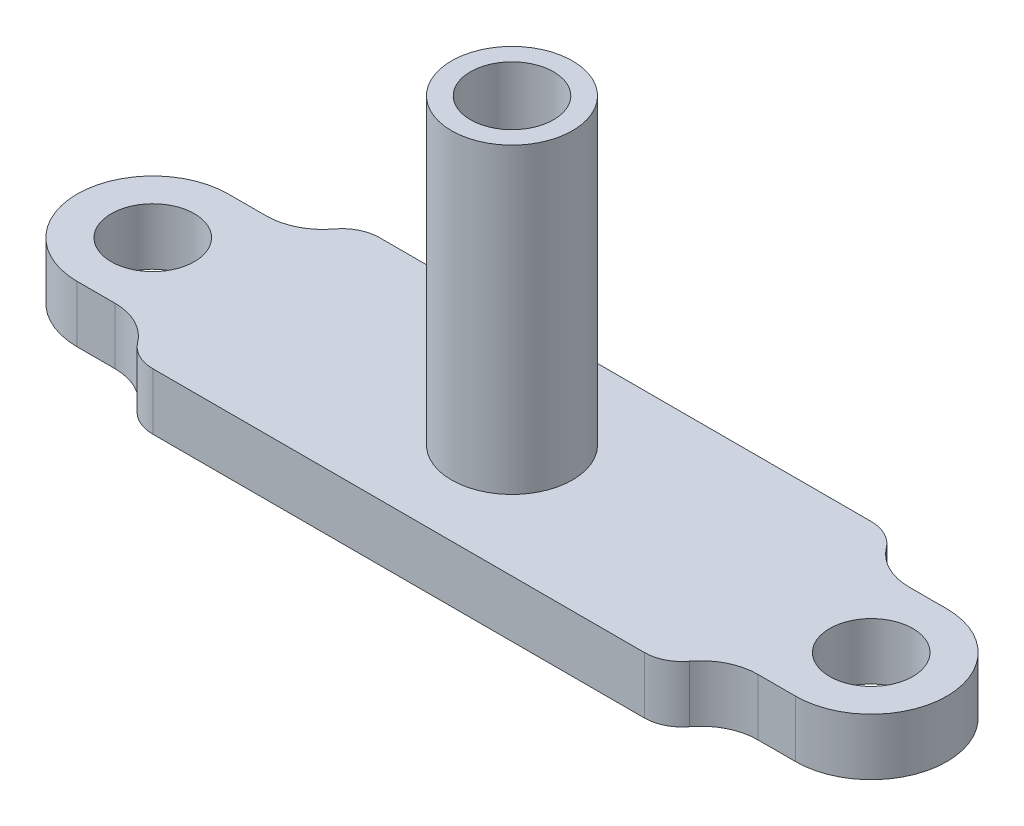
ISO-10303-21;
HEADER;
FILE_DESCRIPTION(('STEP AP214'),'2;1');
FILE_NAME('part.step','',(''),(''),'','','');
FILE_SCHEMA(('AUTOMOTIVE_DESIGN { 1 0 10303 214 1 1 1 1 }'));
ENDSEC;
DATA;
#1=APPLICATION_CONTEXT('core data for automotive mechanical design processes');
#2=APPLICATION_PROTOCOL_DEFINITION('international standard','automotive_design',2000,#1);
#3=PRODUCT_CONTEXT('',#1,'mechanical');
#4=PRODUCT('Part','Part','',(#3));
#5=PRODUCT_RELATED_PRODUCT_CATEGORY('part','',(#4));
#6=PRODUCT_DEFINITION_FORMATION('','',#4);
#7=PRODUCT_DEFINITION_CONTEXT('part definition',#1,'design');
#8=PRODUCT_DEFINITION('design','',#6,#7);
#9=PRODUCT_DEFINITION_SHAPE('','',#8);
#10=(LENGTH_UNIT() NAMED_UNIT(*) SI_UNIT(.MILLI.,.METRE.));
#11=(NAMED_UNIT(*) PLANE_ANGLE_UNIT() SI_UNIT($,.RADIAN.));
#12=(NAMED_UNIT(*) SI_UNIT($,.STERADIAN.) SOLID_ANGLE_UNIT());
#13=UNCERTAINTY_MEASURE_WITH_UNIT(LENGTH_MEASURE(1.E-05),#10,'distance_accuracy_value','');
#14=(GEOMETRIC_REPRESENTATION_CONTEXT(3) GLOBAL_UNCERTAINTY_ASSIGNED_CONTEXT((#13)) GLOBAL_UNIT_ASSIGNED_CONTEXT((#10,
#11,#12)) REPRESENTATION_CONTEXT('',''));
#15=CARTESIAN_POINT('',(0.,0.,0.));
#16=DIRECTION('',(0.,0.,1.));
#17=DIRECTION('',(1.,0.,0.));
#18=AXIS2_PLACEMENT_3D('',#15,#16,#17);
#19=CARTESIAN_POINT('',(-9.5,1.5,0.));
#20=DIRECTION('',(0.,1.,0.));
#21=DIRECTION('',(0.,0.,1.));
#22=AXIS2_PLACEMENT_3D('',#19,#20,#21);
#23=PLANE('',#22);
#24=CARTESIAN_POINT('',(0.,1.5,0.));
#25=DIRECTION('',(0.,1.,0.));
#26=DIRECTION('',(0.,0.,1.));
#27=AXIS2_PLACEMENT_3D('',#24,#25,#26);
#28=CIRCLE('',#27,1.6);
#29=CARTESIAN_POINT('',(0.,1.5,1.6));
#30=VERTEX_POINT('',#29);
#31=EDGE_CURVE('E364',#30,#30,#28,.T.);
#32=ORIENTED_EDGE('',*,*,#31,.F.);
#33=EDGE_LOOP('',(#32));
#34=FACE_BOUND('',#33,.T.);
#35=CARTESIAN_POINT('',(-9.5,1.5,0.));
#36=DIRECTION('',(0.,1.,0.));
#37=DIRECTION('',(0.,0.,1.));
#38=AXIS2_PLACEMENT_3D('',#35,#36,#37);
#39=CIRCLE('',#38,1.1);
#40=CARTESIAN_POINT('',(-9.5,1.5,1.1));
#41=VERTEX_POINT('',#40);
#42=EDGE_CURVE('E206',#41,#41,#39,.T.);
#43=ORIENTED_EDGE('',*,*,#42,.F.);
#44=EDGE_LOOP('',(#43));
#45=FACE_BOUND('',#44,.T.);
#46=DIRECTION('',(1.,0.,0.));
#47=VECTOR('',#46,1.);
#48=CARTESIAN_POINT('',(-7.5,1.5,3.));
#49=LINE('',#48,#47);
#50=CARTESIAN_POINT('',(-6.5,1.5,3.));
#51=VERTEX_POINT('',#50);
#52=CARTESIAN_POINT('',(6.5,1.5,3.));
#53=VERTEX_POINT('',#52);
#54=EDGE_CURVE('E188',#51,#53,#49,.T.);
#55=ORIENTED_EDGE('',*,*,#54,.T.);
#56=CARTESIAN_POINT('',(6.5,1.5,2.));
#57=DIRECTION('',(0.,1.,0.));
#58=DIRECTION('',(0.,0.,1.));
#59=AXIS2_PLACEMENT_3D('',#56,#57,#58);
#60=CIRCLE('',#59,1.);
#61=CARTESIAN_POINT('',(7.3,1.5,2.6));
#62=VERTEX_POINT('',#61);
#63=EDGE_CURVE('E247',#53,#62,#60,.T.);
#64=ORIENTED_EDGE('',*,*,#63,.T.);
#65=CARTESIAN_POINT('',(8.5,1.5,3.5));
#66=DIRECTION('',(0.,1.,0.));
#67=DIRECTION('',(0.,0.,1.));
#68=AXIS2_PLACEMENT_3D('',#65,#66,#67);
#69=CIRCLE('',#68,1.5);
#70=CARTESIAN_POINT('',(8.5,1.5,2.));
#71=VERTEX_POINT('',#70);
#72=EDGE_CURVE('E275',#62,#71,#69,.F.);
#73=ORIENTED_EDGE('',*,*,#72,.T.);
#74=DIRECTION('',(1.,0.,0.));
#75=VECTOR('',#74,1.);
#76=CARTESIAN_POINT('',(9.5,1.5,2.));
#77=LINE('',#76,#75);
#78=CARTESIAN_POINT('',(9.5,1.5,2.));
#79=VERTEX_POINT('',#78);
#80=EDGE_CURVE('E193',#71,#79,#77,.T.);
#81=ORIENTED_EDGE('',*,*,#80,.T.);
#82=CARTESIAN_POINT('',(9.5,1.5,0.));
#83=DIRECTION('',(0.,1.,0.));
#84=DIRECTION('',(0.,0.,-1.));
#85=AXIS2_PLACEMENT_3D('',#82,#83,#84);
#86=CIRCLE('',#85,2.);
#87=CARTESIAN_POINT('',(9.5,1.5,-2.));
#88=VERTEX_POINT('',#87);
#89=EDGE_CURVE('E195',#79,#88,#86,.T.);
#90=ORIENTED_EDGE('',*,*,#89,.T.);
#91=DIRECTION('',(-1.,0.,0.));
#92=VECTOR('',#91,1.);
#93=CARTESIAN_POINT('',(9.5,1.5,-2.));
#94=LINE('',#93,#92);
#95=CARTESIAN_POINT('',(8.5,1.5,-2.));
#96=VERTEX_POINT('',#95);
#97=EDGE_CURVE('E197',#88,#96,#94,.T.);
#98=ORIENTED_EDGE('',*,*,#97,.T.);
#99=CARTESIAN_POINT('',(8.5,1.5,-3.5));
#100=DIRECTION('',(0.,1.,0.));
#101=DIRECTION('',(0.,0.,1.));
#102=AXIS2_PLACEMENT_3D('',#99,#100,#101);
#103=CIRCLE('',#102,1.5);
#104=CARTESIAN_POINT('',(7.3,1.5,-2.6));
#105=VERTEX_POINT('',#104);
#106=EDGE_CURVE('E279',#96,#105,#103,.F.);
#107=ORIENTED_EDGE('',*,*,#106,.T.);
#108=CARTESIAN_POINT('',(6.5,1.5,-2.));
#109=DIRECTION('',(0.,1.,0.));
#110=DIRECTION('',(0.,0.,1.));
#111=AXIS2_PLACEMENT_3D('',#108,#109,#110);
#112=CIRCLE('',#111,1.);
#113=CARTESIAN_POINT('',(6.5,1.5,-3.));
#114=VERTEX_POINT('',#113);
#115=EDGE_CURVE('E245',#105,#114,#112,.T.);
#116=ORIENTED_EDGE('',*,*,#115,.T.);
#117=DIRECTION('',(-1.,0.,0.));
#118=VECTOR('',#117,1.);
#119=CARTESIAN_POINT('',(-7.5,1.5,-3.));
#120=LINE('',#119,#118);
#121=CARTESIAN_POINT('',(-6.5,1.5,-3.));
#122=VERTEX_POINT('',#121);
#123=EDGE_CURVE('E200',#114,#122,#120,.T.);
#124=ORIENTED_EDGE('',*,*,#123,.T.);
#125=CARTESIAN_POINT('',(-6.5,1.5,-2.));
#126=DIRECTION('',(0.,1.,0.));
#127=DIRECTION('',(0.,0.,1.));
#128=AXIS2_PLACEMENT_3D('',#125,#126,#127);
#129=CIRCLE('',#128,1.);
#130=CARTESIAN_POINT('',(-7.3,1.5,-2.6));
#131=VERTEX_POINT('',#130);
#132=EDGE_CURVE('E243',#122,#131,#129,.T.);
#133=ORIENTED_EDGE('',*,*,#132,.T.);
#134=CARTESIAN_POINT('',(-8.5,1.5,-3.5));
#135=DIRECTION('',(0.,1.,0.));
#136=DIRECTION('',(0.,0.,1.));
#137=AXIS2_PLACEMENT_3D('',#134,#135,#136);
#138=CIRCLE('',#137,1.5);
#139=CARTESIAN_POINT('',(-8.5,1.5,-2.));
#140=VERTEX_POINT('',#139);
#141=EDGE_CURVE('E168',#131,#140,#138,.F.);
#142=ORIENTED_EDGE('',*,*,#141,.T.);
#143=DIRECTION('',(-1.,0.,0.));
#144=VECTOR('',#143,1.);
#145=CARTESIAN_POINT('',(-9.5,1.5,-2.));
#146=LINE('',#145,#144);
#147=CARTESIAN_POINT('',(-9.5,1.5,-2.));
#148=VERTEX_POINT('',#147);
#149=EDGE_CURVE('E159',#140,#148,#146,.T.);
#150=ORIENTED_EDGE('',*,*,#149,.T.);
#151=CARTESIAN_POINT('',(-9.5,1.5,0.));
#152=DIRECTION('',(0.,1.,0.));
#153=DIRECTION('',(0.,0.,1.));
#154=AXIS2_PLACEMENT_3D('',#151,#152,#153);
#155=CIRCLE('',#154,2.);
#156=CARTESIAN_POINT('',(-9.5,1.5,2.));
#157=VERTEX_POINT('',#156);
#158=EDGE_CURVE('E164',#148,#157,#155,.T.);
#159=ORIENTED_EDGE('',*,*,#158,.T.);
#160=DIRECTION('',(1.,0.,0.));
#161=VECTOR('',#160,1.);
#162=CARTESIAN_POINT('',(-9.5,1.5,2.));
#163=LINE('',#162,#161);
#164=CARTESIAN_POINT('',(-8.5,1.5,2.));
#165=VERTEX_POINT('',#164);
#166=EDGE_CURVE('E186',#157,#165,#163,.T.);
#167=ORIENTED_EDGE('',*,*,#166,.T.);
#168=CARTESIAN_POINT('',(-8.5,1.5,3.5));
#169=DIRECTION('',(0.,1.,0.));
#170=DIRECTION('',(0.,0.,1.));
#171=AXIS2_PLACEMENT_3D('',#168,#169,#170);
#172=CIRCLE('',#171,1.5);
#173=CARTESIAN_POINT('',(-7.3,1.5,2.6));
#174=VERTEX_POINT('',#173);
#175=EDGE_CURVE('E53',#165,#174,#172,.F.);
#176=ORIENTED_EDGE('',*,*,#175,.T.);
#177=CARTESIAN_POINT('',(-6.5,1.5,2.));
#178=DIRECTION('',(0.,1.,0.));
#179=DIRECTION('',(0.,0.,1.));
#180=AXIS2_PLACEMENT_3D('',#177,#178,#179);
#181=CIRCLE('',#180,1.);
#182=EDGE_CURVE('E241',#174,#51,#181,.T.);
#183=ORIENTED_EDGE('',*,*,#182,.T.);
#184=EDGE_LOOP('',(#55,#64,#73,#81,#90,#98,#107,#116,#124,#133,#142,#150,#159,#167,#176,#183));
#185=FACE_BOUND('',#184,.T.);
#186=CARTESIAN_POINT('',(9.5,1.5,0.));
#187=DIRECTION('',(0.,1.,0.));
#188=DIRECTION('',(0.,0.,-1.));
#189=AXIS2_PLACEMENT_3D('',#186,#187,#188);
#190=CIRCLE('',#189,1.1);
#191=CARTESIAN_POINT('',(9.5,1.5,-1.1));
#192=VERTEX_POINT('',#191);
#193=EDGE_CURVE('E355',#192,#192,#190,.T.);
#194=ORIENTED_EDGE('',*,*,#193,.F.);
#195=EDGE_LOOP('',(#194));
#196=FACE_BOUND('',#195,.T.);
#197=ADVANCED_FACE('F45',(#34,#45,#185,#196),#23,.T.);
#198=CARTESIAN_POINT('',(-9.5,0.,0.));
#199=DIRECTION('',(0.,1.,0.));
#200=DIRECTION('',(0.,0.,1.));
#201=AXIS2_PLACEMENT_3D('',#198,#199,#200);
#202=PLANE('',#201);
#203=DIRECTION('',(1.,0.,0.));
#204=VECTOR('',#203,1.);
#205=CARTESIAN_POINT('',(9.5,0.,2.));
#206=LINE('',#205,#204);
#207=CARTESIAN_POINT('',(8.5,0.,2.));
#208=VERTEX_POINT('',#207);
#209=CARTESIAN_POINT('',(9.5,0.,2.));
#210=VERTEX_POINT('',#209);
#211=EDGE_CURVE('E213',#208,#210,#206,.T.);
#212=ORIENTED_EDGE('',*,*,#211,.F.);
#213=CARTESIAN_POINT('',(8.5,0.,3.5));
#214=DIRECTION('',(0.,1.,0.));
#215=DIRECTION('',(0.,0.,1.));
#216=AXIS2_PLACEMENT_3D('',#213,#214,#215);
#217=CIRCLE('',#216,1.5);
#218=CARTESIAN_POINT('',(7.3,0.,2.6));
#219=VERTEX_POINT('',#218);
#220=EDGE_CURVE('E273',#208,#219,#217,.T.);
#221=ORIENTED_EDGE('',*,*,#220,.T.);
#222=CARTESIAN_POINT('',(6.5,0.,2.));
#223=DIRECTION('',(0.,1.,0.));
#224=DIRECTION('',(0.,0.,1.));
#225=AXIS2_PLACEMENT_3D('',#222,#223,#224);
#226=CIRCLE('',#225,1.);
#227=CARTESIAN_POINT('',(6.5,0.,3.));
#228=VERTEX_POINT('',#227);
#229=EDGE_CURVE('E234',#219,#228,#226,.F.);
#230=ORIENTED_EDGE('',*,*,#229,.T.);
#231=DIRECTION('',(1.,0.,0.));
#232=VECTOR('',#231,1.);
#233=CARTESIAN_POINT('',(-7.5,0.,3.));
#234=LINE('',#233,#232);
#235=CARTESIAN_POINT('',(-6.5,0.,3.));
#236=VERTEX_POINT('',#235);
#237=EDGE_CURVE('E210',#236,#228,#234,.T.);
#238=ORIENTED_EDGE('',*,*,#237,.F.);
#239=CARTESIAN_POINT('',(-6.5,0.,2.));
#240=DIRECTION('',(0.,1.,0.));
#241=DIRECTION('',(0.,0.,1.));
#242=AXIS2_PLACEMENT_3D('',#239,#240,#241);
#243=CIRCLE('',#242,1.);
#244=CARTESIAN_POINT('',(-7.3,0.,2.6));
#245=VERTEX_POINT('',#244);
#246=EDGE_CURVE('E181',#236,#245,#243,.F.);
#247=ORIENTED_EDGE('',*,*,#246,.T.);
#248=CARTESIAN_POINT('',(-8.5,0.,3.5));
#249=DIRECTION('',(0.,1.,0.));
#250=DIRECTION('',(0.,0.,1.));
#251=AXIS2_PLACEMENT_3D('',#248,#249,#250);
#252=CIRCLE('',#251,1.5);
#253=CARTESIAN_POINT('',(-8.5,0.,2.));
#254=VERTEX_POINT('',#253);
#255=EDGE_CURVE('E68',#245,#254,#252,.T.);
#256=ORIENTED_EDGE('',*,*,#255,.T.);
#257=DIRECTION('',(1.,0.,0.));
#258=VECTOR('',#257,1.);
#259=CARTESIAN_POINT('',(-9.5,0.,2.));
#260=LINE('',#259,#258);
#261=CARTESIAN_POINT('',(-9.5,0.,2.));
#262=VERTEX_POINT('',#261);
#263=EDGE_CURVE('E208',#262,#254,#260,.T.);
#264=ORIENTED_EDGE('',*,*,#263,.F.);
#265=CARTESIAN_POINT('',(-9.5,0.,0.));
#266=DIRECTION('',(0.,1.,0.));
#267=DIRECTION('',(0.,0.,1.));
#268=AXIS2_PLACEMENT_3D('',#265,#266,#267);
#269=CIRCLE('',#268,2.);
#270=CARTESIAN_POINT('',(-9.5,0.,-2.));
#271=VERTEX_POINT('',#270);
#272=EDGE_CURVE('E205',#271,#262,#269,.T.);
#273=ORIENTED_EDGE('',*,*,#272,.F.);
#274=DIRECTION('',(-1.,0.,0.));
#275=VECTOR('',#274,1.);
#276=CARTESIAN_POINT('',(-9.5,0.,-2.));
#277=LINE('',#276,#275);
#278=CARTESIAN_POINT('',(-8.5,0.,-2.));
#279=VERTEX_POINT('',#278);
#280=EDGE_CURVE('E178',#279,#271,#277,.T.);
#281=ORIENTED_EDGE('',*,*,#280,.F.);
#282=CARTESIAN_POINT('',(-8.5,0.,-3.5));
#283=DIRECTION('',(0.,1.,0.));
#284=DIRECTION('',(0.,0.,1.));
#285=AXIS2_PLACEMENT_3D('',#282,#283,#284);
#286=CIRCLE('',#285,1.5);
#287=CARTESIAN_POINT('',(-7.3,0.,-2.6));
#288=VERTEX_POINT('',#287);
#289=EDGE_CURVE('E281',#279,#288,#286,.T.);
#290=ORIENTED_EDGE('',*,*,#289,.T.);
#291=CARTESIAN_POINT('',(-6.5,0.,-2.));
#292=DIRECTION('',(0.,1.,0.));
#293=DIRECTION('',(0.,0.,1.));
#294=AXIS2_PLACEMENT_3D('',#291,#292,#293);
#295=CIRCLE('',#294,1.);
#296=CARTESIAN_POINT('',(-6.5,0.,-3.));
#297=VERTEX_POINT('',#296);
#298=EDGE_CURVE('E229',#288,#297,#295,.F.);
#299=ORIENTED_EDGE('',*,*,#298,.T.);
#300=DIRECTION('',(-1.,0.,0.));
#301=VECTOR('',#300,1.);
#302=CARTESIAN_POINT('',(-7.5,0.,-3.));
#303=LINE('',#302,#301);
#304=CARTESIAN_POINT('',(6.5,0.,-3.));
#305=VERTEX_POINT('',#304);
#306=EDGE_CURVE('E172',#305,#297,#303,.T.);
#307=ORIENTED_EDGE('',*,*,#306,.F.);
#308=CARTESIAN_POINT('',(6.5,0.,-2.));
#309=DIRECTION('',(0.,1.,0.));
#310=DIRECTION('',(0.,0.,1.));
#311=AXIS2_PLACEMENT_3D('',#308,#309,#310);
#312=CIRCLE('',#311,1.);
#313=CARTESIAN_POINT('',(7.3,0.,-2.6));
#314=VERTEX_POINT('',#313);
#315=EDGE_CURVE('E231',#305,#314,#312,.F.);
#316=ORIENTED_EDGE('',*,*,#315,.T.);
#317=CARTESIAN_POINT('',(8.5,0.,-3.5));
#318=DIRECTION('',(0.,1.,0.));
#319=DIRECTION('',(0.,0.,1.));
#320=AXIS2_PLACEMENT_3D('',#317,#318,#319);
#321=CIRCLE('',#320,1.5);
#322=CARTESIAN_POINT('',(8.5,0.,-2.));
#323=VERTEX_POINT('',#322);
#324=EDGE_CURVE('E277',#314,#323,#321,.T.);
#325=ORIENTED_EDGE('',*,*,#324,.T.);
#326=DIRECTION('',(-1.,0.,0.));
#327=VECTOR('',#326,1.);
#328=CARTESIAN_POINT('',(9.5,0.,-2.));
#329=LINE('',#328,#327);
#330=CARTESIAN_POINT('',(9.5,0.,-2.));
#331=VERTEX_POINT('',#330);
#332=EDGE_CURVE('E217',#331,#323,#329,.T.);
#333=ORIENTED_EDGE('',*,*,#332,.F.);
#334=CARTESIAN_POINT('',(9.5,0.,0.));
#335=DIRECTION('',(0.,1.,0.));
#336=DIRECTION('',(0.,0.,-1.));
#337=AXIS2_PLACEMENT_3D('',#334,#335,#336);
#338=CIRCLE('',#337,2.);
#339=EDGE_CURVE('E215',#210,#331,#338,.T.);
#340=ORIENTED_EDGE('',*,*,#339,.F.);
#341=EDGE_LOOP('',(#212,#221,#230,#238,#247,#256,#264,#273,#281,#290,#299,#307,#316,#325,#333,#340));
#342=FACE_BOUND('',#341,.T.);
#343=CARTESIAN_POINT('',(-9.5,0.,0.));
#344=DIRECTION('',(0.,1.,0.));
#345=DIRECTION('',(0.,0.,1.));
#346=AXIS2_PLACEMENT_3D('',#343,#344,#345);
#347=CIRCLE('',#346,1.1);
#348=CARTESIAN_POINT('',(-9.5,0.,1.1));
#349=VERTEX_POINT('',#348);
#350=EDGE_CURVE('E353',#349,#349,#347,.T.);
#351=ORIENTED_EDGE('',*,*,#350,.T.);
#352=EDGE_LOOP('',(#351));
#353=FACE_BOUND('',#352,.T.);
#354=CARTESIAN_POINT('',(9.5,0.,0.));
#355=DIRECTION('',(0.,1.,0.));
#356=DIRECTION('',(0.,0.,-1.));
#357=AXIS2_PLACEMENT_3D('',#354,#355,#356);
#358=CIRCLE('',#357,1.1);
#359=CARTESIAN_POINT('',(9.5,0.,-1.1));
#360=VERTEX_POINT('',#359);
#361=EDGE_CURVE('E358',#360,#360,#358,.T.);
#362=ORIENTED_EDGE('',*,*,#361,.T.);
#363=EDGE_LOOP('',(#362));
#364=FACE_BOUND('',#363,.T.);
#365=ADVANCED_FACE('F305',(#342,#353,#364),#202,.F.);
#366=CARTESIAN_POINT('',(-9.5,1.5,-2.));
#367=DIRECTION('',(0.,0.,1.));
#368=DIRECTION('',(1.,0.,0.));
#369=AXIS2_PLACEMENT_3D('',#366,#367,#368);
#370=PLANE('',#369);
#371=ORIENTED_EDGE('',*,*,#149,.F.);
#372=DIRECTION('',(0.,-1.,0.));
#373=VECTOR('',#372,1.);
#374=CARTESIAN_POINT('',(-8.5,1.5,-2.));
#375=LINE('',#374,#373);
#376=EDGE_CURVE('E265',#140,#279,#375,.T.);
#377=ORIENTED_EDGE('',*,*,#376,.T.);
#378=ORIENTED_EDGE('',*,*,#280,.T.);
#379=DIRECTION('',(0.,-1.,0.));
#380=VECTOR('',#379,1.);
#381=CARTESIAN_POINT('',(-9.5,1.5,-2.));
#382=LINE('',#381,#380);
#383=EDGE_CURVE('E175',#148,#271,#382,.T.);
#384=ORIENTED_EDGE('',*,*,#383,.F.);
#385=EDGE_LOOP('',(#371,#377,#378,#384));
#386=FACE_BOUND('',#385,.T.);
#387=ADVANCED_FACE('F176',(#386),#370,.F.);
#388=CARTESIAN_POINT('',(-9.5,1.5,0.));
#389=DIRECTION('',(0.,-1.,0.));
#390=DIRECTION('',(0.,0.,-1.));
#391=AXIS2_PLACEMENT_3D('',#388,#389,#390);
#392=CYLINDRICAL_SURFACE('',#391,2.);
#393=ORIENTED_EDGE('',*,*,#272,.T.);
#394=DIRECTION('',(0.,-1.,0.));
#395=VECTOR('',#394,1.);
#396=CARTESIAN_POINT('',(-9.5,1.5,2.));
#397=LINE('',#396,#395);
#398=EDGE_CURVE('E182',#157,#262,#397,.T.);
#399=ORIENTED_EDGE('',*,*,#398,.F.);
#400=ORIENTED_EDGE('',*,*,#158,.F.);
#401=ORIENTED_EDGE('',*,*,#383,.T.);
#402=EDGE_LOOP('',(#393,#399,#400,#401));
#403=FACE_BOUND('',#402,.T.);
#404=ADVANCED_FACE('F184',(#403),#392,.T.);
#405=CARTESIAN_POINT('',(-9.5,1.5,2.));
#406=DIRECTION('',(0.,0.,-1.));
#407=DIRECTION('',(-1.,0.,0.));
#408=AXIS2_PLACEMENT_3D('',#405,#406,#407);
#409=PLANE('',#408);
#410=ORIENTED_EDGE('',*,*,#263,.T.);
#411=DIRECTION('',(0.,-1.,0.));
#412=VECTOR('',#411,1.);
#413=CARTESIAN_POINT('',(-8.5,1.5,2.));
#414=LINE('',#413,#412);
#415=EDGE_CURVE('E60',#254,#165,#414,.F.);
#416=ORIENTED_EDGE('',*,*,#415,.T.);
#417=ORIENTED_EDGE('',*,*,#166,.F.);
#418=ORIENTED_EDGE('',*,*,#398,.T.);
#419=EDGE_LOOP('',(#410,#416,#417,#418));
#420=FACE_BOUND('',#419,.T.);
#421=ADVANCED_FACE('F395',(#420),#409,.F.);
#422=CARTESIAN_POINT('',(-7.5,1.5,3.));
#423=DIRECTION('',(0.,0.,-1.));
#424=DIRECTION('',(-1.,0.,0.));
#425=AXIS2_PLACEMENT_3D('',#422,#423,#424);
#426=PLANE('',#425);
#427=ORIENTED_EDGE('',*,*,#237,.T.);
#428=DIRECTION('',(0.,-1.,0.));
#429=VECTOR('',#428,1.);
#430=CARTESIAN_POINT('',(6.5,1.5,3.));
#431=LINE('',#430,#429);
#432=EDGE_CURVE('E239',#228,#53,#431,.F.);
#433=ORIENTED_EDGE('',*,*,#432,.T.);
#434=ORIENTED_EDGE('',*,*,#54,.F.);
#435=DIRECTION('',(0.,-1.,0.));
#436=VECTOR('',#435,1.);
#437=CARTESIAN_POINT('',(-6.5,1.5,3.));
#438=LINE('',#437,#436);
#439=EDGE_CURVE('E236',#51,#236,#438,.T.);
#440=ORIENTED_EDGE('',*,*,#439,.T.);
#441=EDGE_LOOP('',(#427,#433,#434,#440));
#442=FACE_BOUND('',#441,.T.);
#443=ADVANCED_FACE('F392',(#442),#426,.F.);
#444=CARTESIAN_POINT('',(9.5,1.5,2.));
#445=DIRECTION('',(0.,0.,-1.));
#446=DIRECTION('',(-1.,0.,0.));
#447=AXIS2_PLACEMENT_3D('',#444,#445,#446);
#448=PLANE('',#447);
#449=ORIENTED_EDGE('',*,*,#80,.F.);
#450=DIRECTION('',(0.,-1.,0.));
#451=VECTOR('',#450,1.);
#452=CARTESIAN_POINT('',(8.5,1.5,2.));
#453=LINE('',#452,#451);
#454=EDGE_CURVE('E255',#71,#208,#453,.T.);
#455=ORIENTED_EDGE('',*,*,#454,.T.);
#456=ORIENTED_EDGE('',*,*,#211,.T.);
#457=DIRECTION('',(0.,-1.,0.));
#458=VECTOR('',#457,1.);
#459=CARTESIAN_POINT('',(9.5,1.5,2.));
#460=LINE('',#459,#458);
#461=EDGE_CURVE('E224',#79,#210,#460,.T.);
#462=ORIENTED_EDGE('',*,*,#461,.F.);
#463=EDGE_LOOP('',(#449,#455,#456,#462));
#464=FACE_BOUND('',#463,.T.);
#465=ADVANCED_FACE('F388',(#464),#448,.F.);
#466=CARTESIAN_POINT('',(9.5,1.5,0.));
#467=DIRECTION('',(0.,-1.,0.));
#468=DIRECTION('',(0.,0.,-1.));
#469=AXIS2_PLACEMENT_3D('',#466,#467,#468);
#470=CYLINDRICAL_SURFACE('',#469,2.);
#471=ORIENTED_EDGE('',*,*,#339,.T.);
#472=DIRECTION('',(0.,-1.,0.));
#473=VECTOR('',#472,1.);
#474=CARTESIAN_POINT('',(9.5,1.5,-2.));
#475=LINE('',#474,#473);
#476=EDGE_CURVE('E203',#88,#331,#475,.T.);
#477=ORIENTED_EDGE('',*,*,#476,.F.);
#478=ORIENTED_EDGE('',*,*,#89,.F.);
#479=ORIENTED_EDGE('',*,*,#461,.T.);
#480=EDGE_LOOP('',(#471,#477,#478,#479));
#481=FACE_BOUND('',#480,.T.);
#482=ADVANCED_FACE('F382',(#481),#470,.T.);
#483=CARTESIAN_POINT('',(9.5,1.5,-2.));
#484=DIRECTION('',(0.,0.,1.));
#485=DIRECTION('',(1.,0.,0.));
#486=AXIS2_PLACEMENT_3D('',#483,#484,#485);
#487=PLANE('',#486);
#488=ORIENTED_EDGE('',*,*,#332,.T.);
#489=DIRECTION('',(0.,-1.,0.));
#490=VECTOR('',#489,1.);
#491=CARTESIAN_POINT('',(8.5,1.5,-2.));
#492=LINE('',#491,#490);
#493=EDGE_CURVE('E263',#323,#96,#492,.F.);
#494=ORIENTED_EDGE('',*,*,#493,.T.);
#495=ORIENTED_EDGE('',*,*,#97,.F.);
#496=ORIENTED_EDGE('',*,*,#476,.T.);
#497=EDGE_LOOP('',(#488,#494,#495,#496));
#498=FACE_BOUND('',#497,.T.);
#499=ADVANCED_FACE('F345',(#498),#487,.F.);
#500=CARTESIAN_POINT('',(-7.5,1.5,-3.));
#501=DIRECTION('',(0.,0.,1.));
#502=DIRECTION('',(1.,0.,0.));
#503=AXIS2_PLACEMENT_3D('',#500,#501,#502);
#504=PLANE('',#503);
#505=ORIENTED_EDGE('',*,*,#123,.F.);
#506=DIRECTION('',(0.,-1.,0.));
#507=VECTOR('',#506,1.);
#508=CARTESIAN_POINT('',(6.5,1.5,-3.));
#509=LINE('',#508,#507);
#510=EDGE_CURVE('E252',#114,#305,#509,.T.);
#511=ORIENTED_EDGE('',*,*,#510,.T.);
#512=ORIENTED_EDGE('',*,*,#306,.T.);
#513=DIRECTION('',(0.,-1.,0.));
#514=VECTOR('',#513,1.);
#515=CARTESIAN_POINT('',(-6.5,1.5,-3.));
#516=LINE('',#515,#514);
#517=EDGE_CURVE('E250',#297,#122,#516,.F.);
#518=ORIENTED_EDGE('',*,*,#517,.T.);
#519=EDGE_LOOP('',(#505,#511,#512,#518));
#520=FACE_BOUND('',#519,.T.);
#521=ADVANCED_FACE('F339',(#520),#504,.F.);
#522=CARTESIAN_POINT('',(-9.5,1.5,0.));
#523=DIRECTION('',(0.,-1.,0.));
#524=DIRECTION('',(0.,0.,-1.));
#525=AXIS2_PLACEMENT_3D('',#522,#523,#524);
#526=CYLINDRICAL_SURFACE('',#525,1.1);
#527=ORIENTED_EDGE('',*,*,#42,.T.);
#528=EDGE_LOOP('',(#527));
#529=FACE_BOUND('',#528,.T.);
#530=ORIENTED_EDGE('',*,*,#350,.F.);
#531=EDGE_LOOP('',(#530));
#532=FACE_BOUND('',#531,.T.);
#533=ADVANCED_FACE('F336',(#529,#532),#526,.F.);
#534=CARTESIAN_POINT('',(9.5,1.5,0.));
#535=DIRECTION('',(0.,-1.,0.));
#536=DIRECTION('',(0.,0.,-1.));
#537=AXIS2_PLACEMENT_3D('',#534,#535,#536);
#538=CYLINDRICAL_SURFACE('',#537,1.1);
#539=ORIENTED_EDGE('',*,*,#193,.T.);
#540=EDGE_LOOP('',(#539));
#541=FACE_BOUND('',#540,.T.);
#542=ORIENTED_EDGE('',*,*,#361,.F.);
#543=EDGE_LOOP('',(#542));
#544=FACE_BOUND('',#543,.T.);
#545=ADVANCED_FACE('F333',(#541,#544),#538,.F.);
#546=CARTESIAN_POINT('',(6.5,1.5,2.));
#547=DIRECTION('',(0.,-1.,0.));
#548=DIRECTION('',(0.,0.,-1.));
#549=AXIS2_PLACEMENT_3D('',#546,#547,#548);
#550=CYLINDRICAL_SURFACE('',#549,1.);
#551=ORIENTED_EDGE('',*,*,#229,.F.);
#552=DIRECTION('',(0.,-1.,0.));
#553=VECTOR('',#552,1.);
#554=CARTESIAN_POINT('',(7.3,1.5,2.6));
#555=LINE('',#554,#553);
#556=EDGE_CURVE('E258',#219,#62,#555,.F.);
#557=ORIENTED_EDGE('',*,*,#556,.T.);
#558=ORIENTED_EDGE('',*,*,#63,.F.);
#559=ORIENTED_EDGE('',*,*,#432,.F.);
#560=EDGE_LOOP('',(#551,#557,#558,#559));
#561=FACE_BOUND('',#560,.T.);
#562=ADVANCED_FACE('F335',(#561),#550,.T.);
#563=CARTESIAN_POINT('',(6.5,1.5,-2.));
#564=DIRECTION('',(0.,-1.,0.));
#565=DIRECTION('',(0.,0.,-1.));
#566=AXIS2_PLACEMENT_3D('',#563,#564,#565);
#567=CYLINDRICAL_SURFACE('',#566,1.);
#568=ORIENTED_EDGE('',*,*,#115,.F.);
#569=DIRECTION('',(0.,-1.,0.));
#570=VECTOR('',#569,1.);
#571=CARTESIAN_POINT('',(7.3,1.5,-2.6));
#572=LINE('',#571,#570);
#573=EDGE_CURVE('E260',#105,#314,#572,.T.);
#574=ORIENTED_EDGE('',*,*,#573,.T.);
#575=ORIENTED_EDGE('',*,*,#315,.F.);
#576=ORIENTED_EDGE('',*,*,#510,.F.);
#577=EDGE_LOOP('',(#568,#574,#575,#576));
#578=FACE_BOUND('',#577,.T.);
#579=ADVANCED_FACE('F405',(#578),#567,.T.);
#580=CARTESIAN_POINT('',(-6.5,1.5,-2.));
#581=DIRECTION('',(0.,-1.,0.));
#582=DIRECTION('',(0.,0.,-1.));
#583=AXIS2_PLACEMENT_3D('',#580,#581,#582);
#584=CYLINDRICAL_SURFACE('',#583,1.);
#585=ORIENTED_EDGE('',*,*,#298,.F.);
#586=DIRECTION('',(0.,-1.,0.));
#587=VECTOR('',#586,1.);
#588=CARTESIAN_POINT('',(-7.3,1.5,-2.6));
#589=LINE('',#588,#587);
#590=EDGE_CURVE('E267',#288,#131,#589,.F.);
#591=ORIENTED_EDGE('',*,*,#590,.T.);
#592=ORIENTED_EDGE('',*,*,#132,.F.);
#593=ORIENTED_EDGE('',*,*,#517,.F.);
#594=EDGE_LOOP('',(#585,#591,#592,#593));
#595=FACE_BOUND('',#594,.T.);
#596=ADVANCED_FACE('F409',(#595),#584,.T.);
#597=CARTESIAN_POINT('',(-6.5,1.5,2.));
#598=DIRECTION('',(0.,-1.,0.));
#599=DIRECTION('',(0.,0.,-1.));
#600=AXIS2_PLACEMENT_3D('',#597,#598,#599);
#601=CYLINDRICAL_SURFACE('',#600,1.);
#602=ORIENTED_EDGE('',*,*,#182,.F.);
#603=DIRECTION('',(0.,-1.,0.));
#604=VECTOR('',#603,1.);
#605=CARTESIAN_POINT('',(-7.3,1.5,2.6));
#606=LINE('',#605,#604);
#607=EDGE_CURVE('E269',#174,#245,#606,.T.);
#608=ORIENTED_EDGE('',*,*,#607,.T.);
#609=ORIENTED_EDGE('',*,*,#246,.F.);
#610=ORIENTED_EDGE('',*,*,#439,.F.);
#611=EDGE_LOOP('',(#602,#608,#609,#610));
#612=FACE_BOUND('',#611,.T.);
#613=ADVANCED_FACE('F291',(#612),#601,.T.);
#614=CARTESIAN_POINT('',(8.5,1.5,3.5));
#615=DIRECTION('',(0.,-1.,0.));
#616=DIRECTION('',(0.,0.,-1.));
#617=AXIS2_PLACEMENT_3D('',#614,#615,#616);
#618=CYLINDRICAL_SURFACE('',#617,1.5);
#619=ORIENTED_EDGE('',*,*,#72,.F.);
#620=ORIENTED_EDGE('',*,*,#556,.F.);
#621=ORIENTED_EDGE('',*,*,#220,.F.);
#622=ORIENTED_EDGE('',*,*,#454,.F.);
#623=EDGE_LOOP('',(#619,#620,#621,#622));
#624=FACE_BOUND('',#623,.T.);
#625=ADVANCED_FACE('F416',(#624),#618,.F.);
#626=CARTESIAN_POINT('',(8.5,1.5,-3.5));
#627=DIRECTION('',(0.,-1.,0.));
#628=DIRECTION('',(0.,0.,-1.));
#629=AXIS2_PLACEMENT_3D('',#626,#627,#628);
#630=CYLINDRICAL_SURFACE('',#629,1.5);
#631=ORIENTED_EDGE('',*,*,#106,.F.);
#632=ORIENTED_EDGE('',*,*,#493,.F.);
#633=ORIENTED_EDGE('',*,*,#324,.F.);
#634=ORIENTED_EDGE('',*,*,#573,.F.);
#635=EDGE_LOOP('',(#631,#632,#633,#634));
#636=FACE_BOUND('',#635,.T.);
#637=ADVANCED_FACE('F303',(#636),#630,.F.);
#638=CARTESIAN_POINT('',(-8.5,1.5,-3.5));
#639=DIRECTION('',(0.,-1.,0.));
#640=DIRECTION('',(0.,0.,-1.));
#641=AXIS2_PLACEMENT_3D('',#638,#639,#640);
#642=CYLINDRICAL_SURFACE('',#641,1.5);
#643=ORIENTED_EDGE('',*,*,#141,.F.);
#644=ORIENTED_EDGE('',*,*,#590,.F.);
#645=ORIENTED_EDGE('',*,*,#289,.F.);
#646=ORIENTED_EDGE('',*,*,#376,.F.);
#647=EDGE_LOOP('',(#643,#644,#645,#646));
#648=FACE_BOUND('',#647,.T.);
#649=ADVANCED_FACE('F294',(#648),#642,.F.);
#650=CARTESIAN_POINT('',(-8.5,1.5,3.5));
#651=DIRECTION('',(0.,-1.,0.));
#652=DIRECTION('',(0.,0.,-1.));
#653=AXIS2_PLACEMENT_3D('',#650,#651,#652);
#654=CYLINDRICAL_SURFACE('',#653,1.5);
#655=ORIENTED_EDGE('',*,*,#175,.F.);
#656=ORIENTED_EDGE('',*,*,#415,.F.);
#657=ORIENTED_EDGE('',*,*,#255,.F.);
#658=ORIENTED_EDGE('',*,*,#607,.F.);
#659=EDGE_LOOP('',(#655,#656,#657,#658));
#660=FACE_BOUND('',#659,.T.);
#661=ADVANCED_FACE('F47',(#660),#654,.F.);
#662=CARTESIAN_POINT('',(0.,9.5,0.));
#663=DIRECTION('',(0.,1.,0.));
#664=DIRECTION('',(0.,0.,1.));
#665=AXIS2_PLACEMENT_3D('',#662,#663,#664);
#666=PLANE('',#665);
#667=CARTESIAN_POINT('',(0.,9.5,0.));
#668=DIRECTION('',(0.,1.,0.));
#669=DIRECTION('',(0.,0.,1.));
#670=AXIS2_PLACEMENT_3D('',#667,#668,#669);
#671=CIRCLE('',#670,1.6);
#672=CARTESIAN_POINT('',(0.,9.5,1.6));
#673=VERTEX_POINT('',#672);
#674=EDGE_CURVE('E362',#673,#673,#671,.T.);
#675=ORIENTED_EDGE('',*,*,#674,.T.);
#676=EDGE_LOOP('',(#675));
#677=FACE_BOUND('',#676,.T.);
#678=CARTESIAN_POINT('',(0.,9.5,0.));
#679=DIRECTION('',(0.,1.,0.));
#680=DIRECTION('',(0.,0.,1.));
#681=AXIS2_PLACEMENT_3D('',#678,#679,#680);
#682=CIRCLE('',#681,1.1);
#683=CARTESIAN_POINT('',(0.,9.5,1.1));
#684=VERTEX_POINT('',#683);
#685=EDGE_CURVE('E367',#684,#684,#682,.T.);
#686=ORIENTED_EDGE('',*,*,#685,.F.);
#687=EDGE_LOOP('',(#686));
#688=FACE_BOUND('',#687,.T.);
#689=ADVANCED_FACE('F293',(#677,#688),#666,.T.);
#690=CARTESIAN_POINT('',(0.,9.5,0.));
#691=DIRECTION('',(0.,-1.,0.));
#692=DIRECTION('',(0.,0.,-1.));
#693=AXIS2_PLACEMENT_3D('',#690,#691,#692);
#694=CYLINDRICAL_SURFACE('',#693,1.6);
#695=ORIENTED_EDGE('',*,*,#674,.F.);
#696=EDGE_LOOP('',(#695));
#697=FACE_BOUND('',#696,.T.);
#698=ORIENTED_EDGE('',*,*,#31,.T.);
#699=EDGE_LOOP('',(#698));
#700=FACE_BOUND('',#699,.T.);
#701=ADVANCED_FACE('F300',(#697,#700),#694,.T.);
#702=CARTESIAN_POINT('',(0.,9.5,0.));
#703=DIRECTION('',(0.,-1.,0.));
#704=DIRECTION('',(0.,0.,-1.));
#705=AXIS2_PLACEMENT_3D('',#702,#703,#704);
#706=CYLINDRICAL_SURFACE('',#705,1.1);
#707=ORIENTED_EDGE('',*,*,#685,.T.);
#708=EDGE_LOOP('',(#707));
#709=FACE_BOUND('',#708,.T.);
#710=CARTESIAN_POINT('',(0.,1.5,0.));
#711=DIRECTION('',(0.,1.,0.));
#712=DIRECTION('',(0.,0.,1.));
#713=AXIS2_PLACEMENT_3D('',#710,#711,#712);
#714=CIRCLE('',#713,1.1);
#715=CARTESIAN_POINT('',(0.,1.5,1.1));
#716=VERTEX_POINT('',#715);
#717=EDGE_CURVE('E11',#716,#716,#714,.F.);
#718=ORIENTED_EDGE('',*,*,#717,.T.);
#719=EDGE_LOOP('',(#718));
#720=FACE_BOUND('',#719,.T.);
#721=ADVANCED_FACE('F317',(#709,#720),#706,.F.);
#722=ORIENTED_EDGE('',*,*,#717,.F.);
#723=EDGE_LOOP('',(#722));
#724=FACE_BOUND('',#723,.T.);
#725=ADVANCED_FACE('F308',(#724),#23,.T.);
#726=CLOSED_SHELL('',(#197,#365,#387,#404,#421,#443,#465,#482,#499,#521,#533,#545,#562,#579,
#596,#613,#625,#637,#649,#661,#689,#701,#721,#725));
#727=MANIFOLD_SOLID_BREP('B2',#726);
#728=ADVANCED_BREP_SHAPE_REPRESENTATION('',(#18,#727),#14);
#729=SHAPE_DEFINITION_REPRESENTATION(#9,#728);
ENDSEC;
END-ISO-10303-21;
